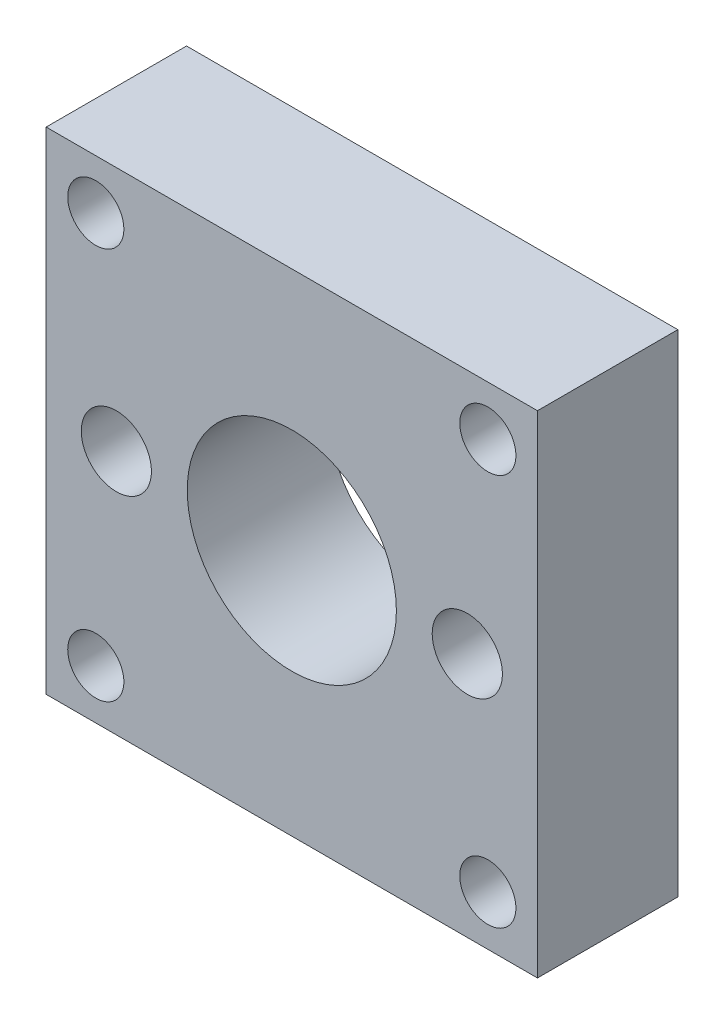
ISO-10303-21;
HEADER;
FILE_DESCRIPTION(('STEP AP214'),'2;1');
FILE_NAME('part.step','',(''),(''),'','','');
FILE_SCHEMA(('AUTOMOTIVE_DESIGN { 1 0 10303 214 1 1 1 1 }'));
ENDSEC;
DATA;
#1=APPLICATION_CONTEXT('core data for automotive mechanical design processes');
#2=APPLICATION_PROTOCOL_DEFINITION('international standard','automotive_design',2000,#1);
#3=PRODUCT_CONTEXT('',#1,'mechanical');
#4=PRODUCT('Part','Part','',(#3));
#5=PRODUCT_RELATED_PRODUCT_CATEGORY('part','',(#4));
#6=PRODUCT_DEFINITION_FORMATION('','',#4);
#7=PRODUCT_DEFINITION_CONTEXT('part definition',#1,'design');
#8=PRODUCT_DEFINITION('design','',#6,#7);
#9=PRODUCT_DEFINITION_SHAPE('','',#8);
#10=(LENGTH_UNIT() NAMED_UNIT(*) SI_UNIT(.MILLI.,.METRE.));
#11=(NAMED_UNIT(*) PLANE_ANGLE_UNIT() SI_UNIT($,.RADIAN.));
#12=(NAMED_UNIT(*) SI_UNIT($,.STERADIAN.) SOLID_ANGLE_UNIT());
#13=UNCERTAINTY_MEASURE_WITH_UNIT(LENGTH_MEASURE(1.E-05),#10,'distance_accuracy_value','');
#14=(GEOMETRIC_REPRESENTATION_CONTEXT(3) GLOBAL_UNCERTAINTY_ASSIGNED_CONTEXT((#13)) GLOBAL_UNIT_ASSIGNED_CONTEXT((#10,
#11,#12)) REPRESENTATION_CONTEXT('',''));
#15=CARTESIAN_POINT('',(0.,0.,0.));
#16=DIRECTION('',(0.,0.,1.));
#17=DIRECTION('',(1.,0.,0.));
#18=AXIS2_PLACEMENT_3D('',#15,#16,#17);
#19=CARTESIAN_POINT('',(0.,0.,10.));
#20=DIRECTION('',(0.,0.,1.));
#21=DIRECTION('',(1.,0.,0.));
#22=AXIS2_PLACEMENT_3D('',#19,#20,#21);
#23=PLANE('',#22);
#24=CARTESIAN_POINT('',(15.2777777777778,2.47027361373853,10.));
#25=DIRECTION('',(0.,0.,1.));
#26=DIRECTION('',(-1.,0.,0.));
#27=AXIS2_PLACEMENT_3D('',#24,#25,#26);
#28=CIRCLE('',#27,2.5);
#29=CARTESIAN_POINT('',(12.7777777777778,2.47027361373853,10.));
#30=VERTEX_POINT('',#29);
#31=EDGE_CURVE('E140',#30,#30,#28,.T.);
#32=ORIENTED_EDGE('',*,*,#31,.F.);
#33=EDGE_LOOP('',(#32));
#34=FACE_BOUND('',#33,.T.);
#35=CARTESIAN_POINT('',(-11.1866883162895,16.4347397078058,10.));
#36=DIRECTION('',(0.,0.,1.));
#37=DIRECTION('',(1.,0.,0.));
#38=AXIS2_PLACEMENT_3D('',#35,#36,#37);
#39=CIRCLE('',#38,2.);
#40=CARTESIAN_POINT('',(-9.18668831628949,16.4347397078058,10.));
#41=VERTEX_POINT('',#40);
#42=EDGE_CURVE('E128',#41,#41,#39,.T.);
#43=ORIENTED_EDGE('',*,*,#42,.F.);
#44=EDGE_LOOP('',(#43));
#45=FACE_BOUND('',#44,.T.);
#46=CARTESIAN_POINT('',(16.742243871845,-11.4941924803287,10.));
#47=DIRECTION('',(0.,0.,1.));
#48=DIRECTION('',(1.,0.,0.));
#49=AXIS2_PLACEMENT_3D('',#46,#47,#48);
#50=CIRCLE('',#49,2.);
#51=CARTESIAN_POINT('',(18.742243871845,-11.4941924803287,10.));
#52=VERTEX_POINT('',#51);
#53=EDGE_CURVE('E116',#52,#52,#50,.T.);
#54=ORIENTED_EDGE('',*,*,#53,.F.);
#55=EDGE_LOOP('',(#54));
#56=FACE_BOUND('',#55,.T.);
#57=DIRECTION('',(0.,-1.,0.));
#58=VECTOR('',#57,1.);
#59=CARTESIAN_POINT('',(-14.7222222222222,19.9702736137385,10.));
#60=LINE('',#59,#58);
#61=CARTESIAN_POINT('',(-14.7222222222222,19.9702736137385,10.));
#62=VERTEX_POINT('',#61);
#63=CARTESIAN_POINT('',(-14.7222222222222,-15.0297263862615,10.));
#64=VERTEX_POINT('',#63);
#65=EDGE_CURVE('E86',#62,#64,#60,.T.);
#66=ORIENTED_EDGE('',*,*,#65,.T.);
#67=DIRECTION('',(1.,0.,0.));
#68=VECTOR('',#67,1.);
#69=CARTESIAN_POINT('',(-14.7222222222222,-15.0297263862615,10.));
#70=LINE('',#69,#68);
#71=CARTESIAN_POINT('',(20.2777777777778,-15.0297263862615,10.));
#72=VERTEX_POINT('',#71);
#73=EDGE_CURVE('E81',#64,#72,#70,.T.);
#74=ORIENTED_EDGE('',*,*,#73,.T.);
#75=DIRECTION('',(0.,1.,0.));
#76=VECTOR('',#75,1.);
#77=CARTESIAN_POINT('',(20.2777777777778,19.9702736137385,10.));
#78=LINE('',#77,#76);
#79=CARTESIAN_POINT('',(20.2777777777778,19.9702736137385,10.));
#80=VERTEX_POINT('',#79);
#81=EDGE_CURVE('E84',#72,#80,#78,.T.);
#82=ORIENTED_EDGE('',*,*,#81,.T.);
#83=DIRECTION('',(-1.,0.,0.));
#84=VECTOR('',#83,1.);
#85=CARTESIAN_POINT('',(-14.7222222222222,19.9702736137385,10.));
#86=LINE('',#85,#84);
#87=EDGE_CURVE('E51',#80,#62,#86,.T.);
#88=ORIENTED_EDGE('',*,*,#87,.T.);
#89=EDGE_LOOP('',(#66,#74,#82,#88));
#90=FACE_BOUND('',#89,.T.);
#91=CARTESIAN_POINT('',(2.77777777777778,2.59259259259261,10.));
#92=DIRECTION('',(0.,0.,1.));
#93=DIRECTION('',(1.,0.,0.));
#94=AXIS2_PLACEMENT_3D('',#91,#92,#93);
#95=CIRCLE('',#94,7.45);
#96=CARTESIAN_POINT('',(10.2277777777778,2.59259259259261,10.));
#97=VERTEX_POINT('',#96);
#98=EDGE_CURVE('E101',#97,#97,#95,.T.);
#99=ORIENTED_EDGE('',*,*,#98,.F.);
#100=EDGE_LOOP('',(#99));
#101=FACE_BOUND('',#100,.T.);
#102=CARTESIAN_POINT('',(16.742243871845,16.4347397078058,10.));
#103=DIRECTION('',(0.,0.,1.));
#104=DIRECTION('',(-1.,0.,0.));
#105=AXIS2_PLACEMENT_3D('',#102,#103,#104);
#106=CIRCLE('',#105,2.);
#107=CARTESIAN_POINT('',(14.742243871845,16.4347397078058,10.));
#108=VERTEX_POINT('',#107);
#109=EDGE_CURVE('E122',#108,#108,#106,.T.);
#110=ORIENTED_EDGE('',*,*,#109,.F.);
#111=EDGE_LOOP('',(#110));
#112=FACE_BOUND('',#111,.T.);
#113=CARTESIAN_POINT('',(-11.1866883162895,-11.4941924803287,10.));
#114=DIRECTION('',(0.,0.,1.));
#115=DIRECTION('',(-1.,0.,0.));
#116=AXIS2_PLACEMENT_3D('',#113,#114,#115);
#117=CIRCLE('',#116,2.);
#118=CARTESIAN_POINT('',(-13.1866883162895,-11.4941924803287,10.));
#119=VERTEX_POINT('',#118);
#120=EDGE_CURVE('E134',#119,#119,#117,.T.);
#121=ORIENTED_EDGE('',*,*,#120,.F.);
#122=EDGE_LOOP('',(#121));
#123=FACE_BOUND('',#122,.T.);
#124=CARTESIAN_POINT('',(-9.72222222222222,2.47027361373853,10.));
#125=DIRECTION('',(0.,0.,1.));
#126=DIRECTION('',(1.,0.,0.));
#127=AXIS2_PLACEMENT_3D('',#124,#125,#126);
#128=CIRCLE('',#127,2.5);
#129=CARTESIAN_POINT('',(-7.22222222222222,2.47027361373853,10.));
#130=VERTEX_POINT('',#129);
#131=EDGE_CURVE('E146',#130,#130,#128,.T.);
#132=ORIENTED_EDGE('',*,*,#131,.F.);
#133=EDGE_LOOP('',(#132));
#134=FACE_BOUND('',#133,.T.);
#135=ADVANCED_FACE('F34',(#34,#45,#56,#90,#101,#112,#123,#134),#23,.T.);
#136=CARTESIAN_POINT('',(0.,0.,0.));
#137=DIRECTION('',(0.,0.,1.));
#138=DIRECTION('',(1.,0.,0.));
#139=AXIS2_PLACEMENT_3D('',#136,#137,#138);
#140=PLANE('',#139);
#141=DIRECTION('',(0.,-1.,0.));
#142=VECTOR('',#141,1.);
#143=CARTESIAN_POINT('',(-14.7222222222222,19.9702736137385,0.));
#144=LINE('',#143,#142);
#145=CARTESIAN_POINT('',(-14.7222222222222,19.9702736137385,0.));
#146=VERTEX_POINT('',#145);
#147=CARTESIAN_POINT('',(-14.7222222222222,-15.0297263862615,0.));
#148=VERTEX_POINT('',#147);
#149=EDGE_CURVE('E98',#146,#148,#144,.T.);
#150=ORIENTED_EDGE('',*,*,#149,.F.);
#151=DIRECTION('',(-1.,0.,0.));
#152=VECTOR('',#151,1.);
#153=CARTESIAN_POINT('',(-14.7222222222222,19.9702736137385,0.));
#154=LINE('',#153,#152);
#155=CARTESIAN_POINT('',(20.2777777777778,19.9702736137385,0.));
#156=VERTEX_POINT('',#155);
#157=EDGE_CURVE('E74',#156,#146,#154,.T.);
#158=ORIENTED_EDGE('',*,*,#157,.F.);
#159=DIRECTION('',(0.,1.,0.));
#160=VECTOR('',#159,1.);
#161=CARTESIAN_POINT('',(20.2777777777778,19.9702736137385,0.));
#162=LINE('',#161,#160);
#163=CARTESIAN_POINT('',(20.2777777777778,-15.0297263862615,0.));
#164=VERTEX_POINT('',#163);
#165=EDGE_CURVE('E68',#164,#156,#162,.T.);
#166=ORIENTED_EDGE('',*,*,#165,.F.);
#167=DIRECTION('',(1.,0.,0.));
#168=VECTOR('',#167,1.);
#169=CARTESIAN_POINT('',(-14.7222222222222,-15.0297263862615,0.));
#170=LINE('',#169,#168);
#171=EDGE_CURVE('E90',#148,#164,#170,.T.);
#172=ORIENTED_EDGE('',*,*,#171,.F.);
#173=EDGE_LOOP('',(#150,#158,#166,#172));
#174=FACE_BOUND('',#173,.T.);
#175=CARTESIAN_POINT('',(2.77777777777778,2.59259259259261,0.));
#176=DIRECTION('',(0.,0.,1.));
#177=DIRECTION('',(1.,0.,0.));
#178=AXIS2_PLACEMENT_3D('',#175,#176,#177);
#179=CIRCLE('',#178,7.45);
#180=CARTESIAN_POINT('',(10.2277777777778,2.59259259259261,0.));
#181=VERTEX_POINT('',#180);
#182=EDGE_CURVE('E113',#181,#181,#179,.T.);
#183=ORIENTED_EDGE('',*,*,#182,.T.);
#184=EDGE_LOOP('',(#183));
#185=FACE_BOUND('',#184,.T.);
#186=CARTESIAN_POINT('',(16.742243871845,-11.4941924803287,0.));
#187=DIRECTION('',(0.,0.,1.));
#188=DIRECTION('',(1.,0.,0.));
#189=AXIS2_PLACEMENT_3D('',#186,#187,#188);
#190=CIRCLE('',#189,2.);
#191=CARTESIAN_POINT('',(18.742243871845,-11.4941924803287,0.));
#192=VERTEX_POINT('',#191);
#193=EDGE_CURVE('E119',#192,#192,#190,.T.);
#194=ORIENTED_EDGE('',*,*,#193,.T.);
#195=EDGE_LOOP('',(#194));
#196=FACE_BOUND('',#195,.T.);
#197=CARTESIAN_POINT('',(16.742243871845,16.4347397078058,0.));
#198=DIRECTION('',(0.,0.,1.));
#199=DIRECTION('',(-1.,0.,0.));
#200=AXIS2_PLACEMENT_3D('',#197,#198,#199);
#201=CIRCLE('',#200,2.);
#202=CARTESIAN_POINT('',(14.742243871845,16.4347397078058,0.));
#203=VERTEX_POINT('',#202);
#204=EDGE_CURVE('E125',#203,#203,#201,.T.);
#205=ORIENTED_EDGE('',*,*,#204,.T.);
#206=EDGE_LOOP('',(#205));
#207=FACE_BOUND('',#206,.T.);
#208=CARTESIAN_POINT('',(-11.1866883162895,16.4347397078058,0.));
#209=DIRECTION('',(0.,0.,1.));
#210=DIRECTION('',(1.,0.,0.));
#211=AXIS2_PLACEMENT_3D('',#208,#209,#210);
#212=CIRCLE('',#211,2.);
#213=CARTESIAN_POINT('',(-9.18668831628949,16.4347397078058,0.));
#214=VERTEX_POINT('',#213);
#215=EDGE_CURVE('E131',#214,#214,#212,.T.);
#216=ORIENTED_EDGE('',*,*,#215,.T.);
#217=EDGE_LOOP('',(#216));
#218=FACE_BOUND('',#217,.T.);
#219=CARTESIAN_POINT('',(-11.1866883162895,-11.4941924803287,0.));
#220=DIRECTION('',(0.,0.,1.));
#221=DIRECTION('',(-1.,0.,0.));
#222=AXIS2_PLACEMENT_3D('',#219,#220,#221);
#223=CIRCLE('',#222,2.);
#224=CARTESIAN_POINT('',(-13.1866883162895,-11.4941924803287,0.));
#225=VERTEX_POINT('',#224);
#226=EDGE_CURVE('E137',#225,#225,#223,.T.);
#227=ORIENTED_EDGE('',*,*,#226,.T.);
#228=EDGE_LOOP('',(#227));
#229=FACE_BOUND('',#228,.T.);
#230=CARTESIAN_POINT('',(15.2777777777778,2.47027361373853,0.));
#231=DIRECTION('',(0.,0.,1.));
#232=DIRECTION('',(-1.,0.,0.));
#233=AXIS2_PLACEMENT_3D('',#230,#231,#232);
#234=CIRCLE('',#233,2.5);
#235=CARTESIAN_POINT('',(12.7777777777778,2.47027361373853,0.));
#236=VERTEX_POINT('',#235);
#237=EDGE_CURVE('E143',#236,#236,#234,.T.);
#238=ORIENTED_EDGE('',*,*,#237,.T.);
#239=EDGE_LOOP('',(#238));
#240=FACE_BOUND('',#239,.T.);
#241=CARTESIAN_POINT('',(-9.72222222222222,2.47027361373853,0.));
#242=DIRECTION('',(0.,0.,1.));
#243=DIRECTION('',(1.,0.,0.));
#244=AXIS2_PLACEMENT_3D('',#241,#242,#243);
#245=CIRCLE('',#244,2.5);
#246=CARTESIAN_POINT('',(-7.22222222222222,2.47027361373853,0.));
#247=VERTEX_POINT('',#246);
#248=EDGE_CURVE('E149',#247,#247,#245,.T.);
#249=ORIENTED_EDGE('',*,*,#248,.T.);
#250=EDGE_LOOP('',(#249));
#251=FACE_BOUND('',#250,.T.);
#252=ADVANCED_FACE('F109',(#174,#185,#196,#207,#218,#229,#240,#251),#140,.F.);
#253=CARTESIAN_POINT('',(-14.7222222222222,19.9702736137385,10.));
#254=DIRECTION('',(1.,0.,0.));
#255=DIRECTION('',(0.,1.,0.));
#256=AXIS2_PLACEMENT_3D('',#253,#254,#255);
#257=PLANE('',#256);
#258=ORIENTED_EDGE('',*,*,#149,.T.);
#259=DIRECTION('',(0.,0.,-1.));
#260=VECTOR('',#259,1.);
#261=CARTESIAN_POINT('',(-14.7222222222222,-15.0297263862615,10.));
#262=LINE('',#261,#260);
#263=EDGE_CURVE('E11',#64,#148,#262,.T.);
#264=ORIENTED_EDGE('',*,*,#263,.F.);
#265=ORIENTED_EDGE('',*,*,#65,.F.);
#266=DIRECTION('',(0.,0.,-1.));
#267=VECTOR('',#266,1.);
#268=CARTESIAN_POINT('',(-14.7222222222222,19.9702736137385,10.));
#269=LINE('',#268,#267);
#270=EDGE_CURVE('E94',#62,#146,#269,.T.);
#271=ORIENTED_EDGE('',*,*,#270,.T.);
#272=EDGE_LOOP('',(#258,#264,#265,#271));
#273=FACE_BOUND('',#272,.T.);
#274=ADVANCED_FACE('F36',(#273),#257,.F.);
#275=CARTESIAN_POINT('',(-14.7222222222222,-15.0297263862615,10.));
#276=DIRECTION('',(0.,1.,0.));
#277=DIRECTION('',(-1.,0.,0.));
#278=AXIS2_PLACEMENT_3D('',#275,#276,#277);
#279=PLANE('',#278);
#280=ORIENTED_EDGE('',*,*,#171,.T.);
#281=DIRECTION('',(0.,0.,-1.));
#282=VECTOR('',#281,1.);
#283=CARTESIAN_POINT('',(20.2777777777778,-15.0297263862615,10.));
#284=LINE('',#283,#282);
#285=EDGE_CURVE('E43',#72,#164,#284,.T.);
#286=ORIENTED_EDGE('',*,*,#285,.F.);
#287=ORIENTED_EDGE('',*,*,#73,.F.);
#288=ORIENTED_EDGE('',*,*,#263,.T.);
#289=EDGE_LOOP('',(#280,#286,#287,#288));
#290=FACE_BOUND('',#289,.T.);
#291=ADVANCED_FACE('F89',(#290),#279,.F.);
#292=CARTESIAN_POINT('',(20.2777777777778,19.9702736137385,10.));
#293=DIRECTION('',(-1.,0.,0.));
#294=DIRECTION('',(0.,0.,1.));
#295=AXIS2_PLACEMENT_3D('',#292,#293,#294);
#296=PLANE('',#295);
#297=ORIENTED_EDGE('',*,*,#165,.T.);
#298=DIRECTION('',(0.,0.,-1.));
#299=VECTOR('',#298,1.);
#300=CARTESIAN_POINT('',(20.2777777777778,19.9702736137385,10.));
#301=LINE('',#300,#299);
#302=EDGE_CURVE('E91',#80,#156,#301,.T.);
#303=ORIENTED_EDGE('',*,*,#302,.F.);
#304=ORIENTED_EDGE('',*,*,#81,.F.);
#305=ORIENTED_EDGE('',*,*,#285,.T.);
#306=EDGE_LOOP('',(#297,#303,#304,#305));
#307=FACE_BOUND('',#306,.T.);
#308=ADVANCED_FACE('F92',(#307),#296,.F.);
#309=CARTESIAN_POINT('',(-14.7222222222222,19.9702736137385,10.));
#310=DIRECTION('',(0.,-1.,0.));
#311=DIRECTION('',(0.,0.,-1.));
#312=AXIS2_PLACEMENT_3D('',#309,#310,#311);
#313=PLANE('',#312);
#314=ORIENTED_EDGE('',*,*,#157,.T.);
#315=ORIENTED_EDGE('',*,*,#270,.F.);
#316=ORIENTED_EDGE('',*,*,#87,.F.);
#317=ORIENTED_EDGE('',*,*,#302,.T.);
#318=EDGE_LOOP('',(#314,#315,#316,#317));
#319=FACE_BOUND('',#318,.T.);
#320=ADVANCED_FACE('F106',(#319),#313,.F.);
#321=CARTESIAN_POINT('',(2.77777777777778,2.59259259259261,10.));
#322=DIRECTION('',(0.,0.,-1.));
#323=DIRECTION('',(-1.,0.,0.));
#324=AXIS2_PLACEMENT_3D('',#321,#322,#323);
#325=CYLINDRICAL_SURFACE('',#324,7.45);
#326=ORIENTED_EDGE('',*,*,#98,.T.);
#327=EDGE_LOOP('',(#326));
#328=FACE_BOUND('',#327,.T.);
#329=ORIENTED_EDGE('',*,*,#182,.F.);
#330=EDGE_LOOP('',(#329));
#331=FACE_BOUND('',#330,.T.);
#332=ADVANCED_FACE('F168',(#328,#331),#325,.F.);
#333=CARTESIAN_POINT('',(16.742243871845,-11.4941924803287,10.));
#334=DIRECTION('',(0.,0.,-1.));
#335=DIRECTION('',(-1.,0.,0.));
#336=AXIS2_PLACEMENT_3D('',#333,#334,#335);
#337=CYLINDRICAL_SURFACE('',#336,2.);
#338=ORIENTED_EDGE('',*,*,#53,.T.);
#339=EDGE_LOOP('',(#338));
#340=FACE_BOUND('',#339,.T.);
#341=ORIENTED_EDGE('',*,*,#193,.F.);
#342=EDGE_LOOP('',(#341));
#343=FACE_BOUND('',#342,.T.);
#344=ADVANCED_FACE('F214',(#340,#343),#337,.F.);
#345=CARTESIAN_POINT('',(16.742243871845,16.4347397078058,10.));
#346=DIRECTION('',(0.,0.,-1.));
#347=DIRECTION('',(-1.,0.,0.));
#348=AXIS2_PLACEMENT_3D('',#345,#346,#347);
#349=CYLINDRICAL_SURFACE('',#348,2.);
#350=ORIENTED_EDGE('',*,*,#109,.T.);
#351=EDGE_LOOP('',(#350));
#352=FACE_BOUND('',#351,.T.);
#353=ORIENTED_EDGE('',*,*,#204,.F.);
#354=EDGE_LOOP('',(#353));
#355=FACE_BOUND('',#354,.T.);
#356=ADVANCED_FACE('F222',(#352,#355),#349,.F.);
#357=CARTESIAN_POINT('',(-11.1866883162895,16.4347397078058,10.));
#358=DIRECTION('',(0.,0.,-1.));
#359=DIRECTION('',(-1.,0.,0.));
#360=AXIS2_PLACEMENT_3D('',#357,#358,#359);
#361=CYLINDRICAL_SURFACE('',#360,2.);
#362=ORIENTED_EDGE('',*,*,#42,.T.);
#363=EDGE_LOOP('',(#362));
#364=FACE_BOUND('',#363,.T.);
#365=ORIENTED_EDGE('',*,*,#215,.F.);
#366=EDGE_LOOP('',(#365));
#367=FACE_BOUND('',#366,.T.);
#368=ADVANCED_FACE('F230',(#364,#367),#361,.F.);
#369=CARTESIAN_POINT('',(-11.1866883162895,-11.4941924803287,10.));
#370=DIRECTION('',(0.,0.,-1.));
#371=DIRECTION('',(-1.,0.,0.));
#372=AXIS2_PLACEMENT_3D('',#369,#370,#371);
#373=CYLINDRICAL_SURFACE('',#372,2.);
#374=ORIENTED_EDGE('',*,*,#120,.T.);
#375=EDGE_LOOP('',(#374));
#376=FACE_BOUND('',#375,.T.);
#377=ORIENTED_EDGE('',*,*,#226,.F.);
#378=EDGE_LOOP('',(#377));
#379=FACE_BOUND('',#378,.T.);
#380=ADVANCED_FACE('F239',(#376,#379),#373,.F.);
#381=CARTESIAN_POINT('',(15.2777777777778,2.47027361373853,10.));
#382=DIRECTION('',(0.,0.,-1.));
#383=DIRECTION('',(-1.,0.,0.));
#384=AXIS2_PLACEMENT_3D('',#381,#382,#383);
#385=CYLINDRICAL_SURFACE('',#384,2.5);
#386=ORIENTED_EDGE('',*,*,#31,.T.);
#387=EDGE_LOOP('',(#386));
#388=FACE_BOUND('',#387,.T.);
#389=ORIENTED_EDGE('',*,*,#237,.F.);
#390=EDGE_LOOP('',(#389));
#391=FACE_BOUND('',#390,.T.);
#392=ADVANCED_FACE('F248',(#388,#391),#385,.F.);
#393=CARTESIAN_POINT('',(-9.72222222222222,2.47027361373853,10.));
#394=DIRECTION('',(0.,0.,-1.));
#395=DIRECTION('',(-1.,0.,0.));
#396=AXIS2_PLACEMENT_3D('',#393,#394,#395);
#397=CYLINDRICAL_SURFACE('',#396,2.5);
#398=ORIENTED_EDGE('',*,*,#131,.T.);
#399=EDGE_LOOP('',(#398));
#400=FACE_BOUND('',#399,.T.);
#401=ORIENTED_EDGE('',*,*,#248,.F.);
#402=EDGE_LOOP('',(#401));
#403=FACE_BOUND('',#402,.T.);
#404=ADVANCED_FACE('F155',(#400,#403),#397,.F.);
#405=CLOSED_SHELL('',(#135,#252,#274,#291,#308,#320,#332,#344,#356,#368,#380,#392,#404));
#406=MANIFOLD_SOLID_BREP('B2',#405);
#407=ADVANCED_BREP_SHAPE_REPRESENTATION('',(#18,#406),#14);
#408=SHAPE_DEFINITION_REPRESENTATION(#9,#407);
ENDSEC;
END-ISO-10303-21;
